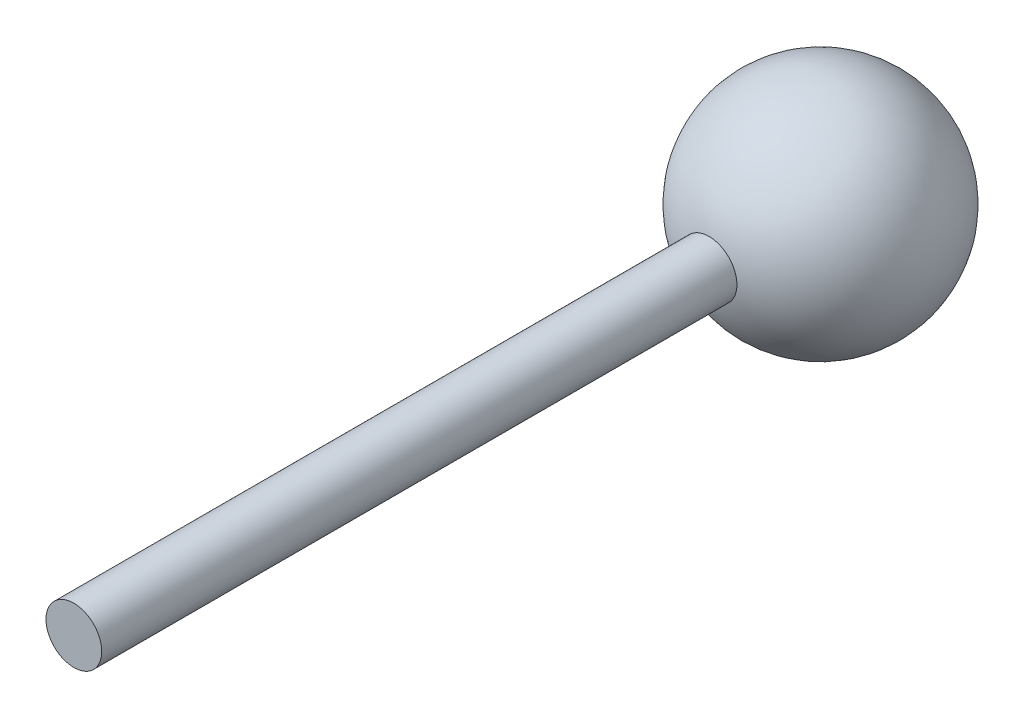
ISO-10303-21;
HEADER;
FILE_DESCRIPTION(('STEP AP214'),'2;1');
FILE_NAME('part.step','',(''),(''),'','','');
FILE_SCHEMA(('AUTOMOTIVE_DESIGN { 1 0 10303 214 1 1 1 1 }'));
ENDSEC;
DATA;
#1=APPLICATION_CONTEXT('core data for automotive mechanical design processes');
#2=APPLICATION_PROTOCOL_DEFINITION('international standard','automotive_design',2000,#1);
#3=PRODUCT_CONTEXT('',#1,'mechanical');
#4=PRODUCT('Part','Part','',(#3));
#5=PRODUCT_RELATED_PRODUCT_CATEGORY('part','',(#4));
#6=PRODUCT_DEFINITION_FORMATION('','',#4);
#7=PRODUCT_DEFINITION_CONTEXT('part definition',#1,'design');
#8=PRODUCT_DEFINITION('design','',#6,#7);
#9=PRODUCT_DEFINITION_SHAPE('','',#8);
#10=(LENGTH_UNIT() NAMED_UNIT(*) SI_UNIT(.MILLI.,.METRE.));
#11=(NAMED_UNIT(*) PLANE_ANGLE_UNIT() SI_UNIT($,.RADIAN.));
#12=(NAMED_UNIT(*) SI_UNIT($,.STERADIAN.) SOLID_ANGLE_UNIT());
#13=UNCERTAINTY_MEASURE_WITH_UNIT(LENGTH_MEASURE(1.E-05),#10,'distance_accuracy_value','');
#14=(GEOMETRIC_REPRESENTATION_CONTEXT(3) GLOBAL_UNCERTAINTY_ASSIGNED_CONTEXT((#13)) GLOBAL_UNIT_ASSIGNED_CONTEXT((#10,
#11,#12)) REPRESENTATION_CONTEXT('',''));
#15=CARTESIAN_POINT('',(0.,0.,0.));
#16=DIRECTION('',(0.,0.,1.));
#17=DIRECTION('',(1.,0.,0.));
#18=AXIS2_PLACEMENT_3D('',#15,#16,#17);
#19=CARTESIAN_POINT('',(0.,0.,67.));
#20=DIRECTION('',(0.,0.,-1.));
#21=DIRECTION('',(-1.,0.,0.));
#22=AXIS2_PLACEMENT_3D('',#19,#20,#21);
#23=CYLINDRICAL_SURFACE('',#22,2.5);
#24=CARTESIAN_POINT('',(0.,0.,67.));
#25=DIRECTION('',(0.,0.,1.));
#26=DIRECTION('',(1.,0.,0.));
#27=AXIS2_PLACEMENT_3D('',#24,#25,#26);
#28=CIRCLE('',#27,2.5);
#29=CARTESIAN_POINT('',(-2.5,0.,67.));
#30=VERTEX_POINT('',#29);
#31=EDGE_CURVE('E11',#30,#30,#28,.T.);
#32=CARTESIAN_POINT('',(0.,0.,10.));
#33=DIRECTION('',(0.,0.,1.));
#34=DIRECTION('',(1.,0.,0.));
#35=AXIS2_PLACEMENT_3D('',#32,#33,#34);
#36=CIRCLE('',#35,2.5);
#37=CARTESIAN_POINT('',(-2.5,0.,10.));
#38=VERTEX_POINT('',#37);
#39=EDGE_CURVE('E49',#38,#38,#36,.T.);
#40=CARTESIAN_POINT('',(-2.5,0.,67.));
#41=CARTESIAN_POINT('',(-2.5,0.,66.40625));
#42=CARTESIAN_POINT('',(-2.5,0.,65.8125));
#43=CARTESIAN_POINT('',(-2.5,0.,64.625));
#44=CARTESIAN_POINT('',(-2.5,0.,64.03125));
#45=CARTESIAN_POINT('',(-2.5,0.,62.84375));
#46=CARTESIAN_POINT('',(-2.5,0.,62.25));
#47=CARTESIAN_POINT('',(-2.5,0.,61.0625));
#48=CARTESIAN_POINT('',(-2.5,0.,60.46875));
#49=CARTESIAN_POINT('',(-2.5,0.,59.28125));
#50=CARTESIAN_POINT('',(-2.5,0.,58.6875));
#51=CARTESIAN_POINT('',(-2.5,0.,57.5));
#52=CARTESIAN_POINT('',(-2.5,0.,56.90625));
#53=CARTESIAN_POINT('',(-2.5,0.,55.71875));
#54=CARTESIAN_POINT('',(-2.5,0.,55.125));
#55=CARTESIAN_POINT('',(-2.5,0.,53.9375));
#56=CARTESIAN_POINT('',(-2.5,0.,53.34375));
#57=CARTESIAN_POINT('',(-2.5,0.,52.15625));
#58=CARTESIAN_POINT('',(-2.5,0.,51.5625));
#59=CARTESIAN_POINT('',(-2.5,0.,50.375));
#60=CARTESIAN_POINT('',(-2.5,0.,49.78125));
#61=CARTESIAN_POINT('',(-2.5,0.,48.59375));
#62=CARTESIAN_POINT('',(-2.5,0.,48.));
#63=CARTESIAN_POINT('',(-2.5,0.,46.8125));
#64=CARTESIAN_POINT('',(-2.5,0.,46.21875));
#65=CARTESIAN_POINT('',(-2.5,0.,45.03125));
#66=CARTESIAN_POINT('',(-2.5,0.,44.4375));
#67=CARTESIAN_POINT('',(-2.5,0.,43.25));
#68=CARTESIAN_POINT('',(-2.5,0.,42.65625));
#69=CARTESIAN_POINT('',(-2.5,0.,41.46875));
#70=CARTESIAN_POINT('',(-2.5,0.,40.875));
#71=CARTESIAN_POINT('',(-2.5,0.,39.6875));
#72=CARTESIAN_POINT('',(-2.5,0.,39.09375));
#73=CARTESIAN_POINT('',(-2.5,0.,37.90625));
#74=CARTESIAN_POINT('',(-2.5,0.,37.3125));
#75=CARTESIAN_POINT('',(-2.5,0.,36.125));
#76=CARTESIAN_POINT('',(-2.5,0.,35.53125));
#77=CARTESIAN_POINT('',(-2.5,0.,34.34375));
#78=CARTESIAN_POINT('',(-2.5,0.,33.75));
#79=CARTESIAN_POINT('',(-2.5,0.,32.5625));
#80=CARTESIAN_POINT('',(-2.5,0.,31.96875));
#81=CARTESIAN_POINT('',(-2.5,0.,30.78125));
#82=CARTESIAN_POINT('',(-2.5,0.,30.1875));
#83=CARTESIAN_POINT('',(-2.5,0.,29.));
#84=CARTESIAN_POINT('',(-2.5,0.,28.40625));
#85=CARTESIAN_POINT('',(-2.5,0.,27.21875));
#86=CARTESIAN_POINT('',(-2.5,0.,26.625));
#87=CARTESIAN_POINT('',(-2.5,0.,25.4375));
#88=CARTESIAN_POINT('',(-2.5,0.,24.84375));
#89=CARTESIAN_POINT('',(-2.5,0.,23.65625));
#90=CARTESIAN_POINT('',(-2.5,0.,23.0625));
#91=CARTESIAN_POINT('',(-2.5,0.,21.875));
#92=CARTESIAN_POINT('',(-2.5,0.,21.28125));
#93=CARTESIAN_POINT('',(-2.5,0.,20.09375));
#94=CARTESIAN_POINT('',(-2.5,0.,19.5));
#95=CARTESIAN_POINT('',(-2.5,0.,18.3125));
#96=CARTESIAN_POINT('',(-2.5,0.,17.71875));
#97=CARTESIAN_POINT('',(-2.5,0.,16.53125));
#98=CARTESIAN_POINT('',(-2.5,0.,15.9375));
#99=CARTESIAN_POINT('',(-2.5,0.,14.75));
#100=CARTESIAN_POINT('',(-2.5,0.,14.15625));
#101=CARTESIAN_POINT('',(-2.5,0.,12.96875));
#102=CARTESIAN_POINT('',(-2.5,0.,12.375));
#103=CARTESIAN_POINT('',(-2.5,0.,11.1875));
#104=CARTESIAN_POINT('',(-2.5,0.,10.59375));
#105=CARTESIAN_POINT('',(-2.5,0.,10.));
#106=B_SPLINE_CURVE_WITH_KNOTS('',3,(#40,#41,#42,#43,#44,#45,#46,#47,#48,#49,#50,#51,#52,#53,
#54,#55,#56,#57,#58,#59,#60,#61,#62,#63,#64,#65,#66,#67,#68,#69,#70,#71,#72,#73,#74,#75,#76,#77,
#78,#79,#80,#81,#82,#83,#84,#85,#86,#87,#88,#89,#90,#91,#92,#93,#94,#95,#96,#97,#98,#99,#100,
#101,#102,#103,#104,#105),.UNSPECIFIED.,.F.,.F.,(4,2,2,2,2,2,2,2,2,2,2,2,2,2,2,2,2,2,2,2,2,2,2,
2,2,2,2,2,2,2,2,2,4),(0.,1.78125000000001,3.56250000000001,5.34375000000001,7.12500000000001,
8.90625,10.6875,12.46875,14.25,16.03125,17.8125,19.59375,21.375,23.15625,24.9375,26.71875,28.5,
30.28125,32.0625,33.84375,35.625,37.40625,39.1875,40.96875,42.75,44.53125,46.3125,48.09375,
49.875,51.65625,53.4375,55.21875,57.),.UNSPECIFIED.);
#107=EDGE_CURVE('BSEAM46',#30,#38,#106,.T.);
#108=ORIENTED_EDGE('',*,*,#31,.F.);
#109=ORIENTED_EDGE('',*,*,#39,.T.);
#110=ORIENTED_EDGE('',*,*,#107,.T.);
#111=ORIENTED_EDGE('',*,*,#107,.F.);
#112=EDGE_LOOP('',(#108,#110,#109,#111));
#113=FACE_BOUND('',#112,.T.);
#114=ADVANCED_FACE('F46',(#113),#23,.T.);
#115=CARTESIAN_POINT('',(0.,0.,67.));
#116=DIRECTION('',(0.,0.,1.));
#117=DIRECTION('',(1.,0.,0.));
#118=AXIS2_PLACEMENT_3D('',#115,#116,#117);
#119=PLANE('',#118);
#120=ORIENTED_EDGE('',*,*,#31,.T.);
#121=EDGE_LOOP('',(#120));
#122=FACE_BOUND('',#121,.T.);
#123=ADVANCED_FACE('F61',(#122),#119,.T.);
#124=CARTESIAN_POINT('',(0.,0.,10.));
#125=DIRECTION('',(0.,0.,1.));
#126=DIRECTION('',(1.,0.,0.));
#127=AXIS2_PLACEMENT_3D('',#124,#125,#126);
#128=PLANE('',#127);
#129=ORIENTED_EDGE('',*,*,#39,.F.);
#130=EDGE_LOOP('',(#129));
#131=FACE_BOUND('',#130,.T.);
#132=ADVANCED_FACE('F59',(#131),#128,.F.);
#133=CLOSED_SHELL('',(#114,#123,#132));
#134=MANIFOLD_SOLID_BREP('B2',#133);
#135=CARTESIAN_POINT('',(0.,0.,0.));
#136=DIRECTION('',(-1.,0.,0.));
#137=DIRECTION('',(0.,1.,0.));
#138=AXIS2_PLACEMENT_3D('',#135,#136,#137);
#139=SPHERICAL_SURFACE('',#138,10.);
#140=CARTESIAN_POINT('',(-10.,0.,0.));
#141=VERTEX_POINT('',#140);
#142=VERTEX_LOOP('',#141);
#143=FACE_BOUND('',#142,.T.);
#144=ADVANCED_FACE('F90',(#143),#139,.T.);
#145=CLOSED_SHELL('',(#144));
#146=MANIFOLD_SOLID_BREP('B6',#145);
#147=ADVANCED_BREP_SHAPE_REPRESENTATION('',(#18,#134,#146),#14);
#148=SHAPE_DEFINITION_REPRESENTATION(#9,#147);
ENDSEC;
END-ISO-10303-21;
